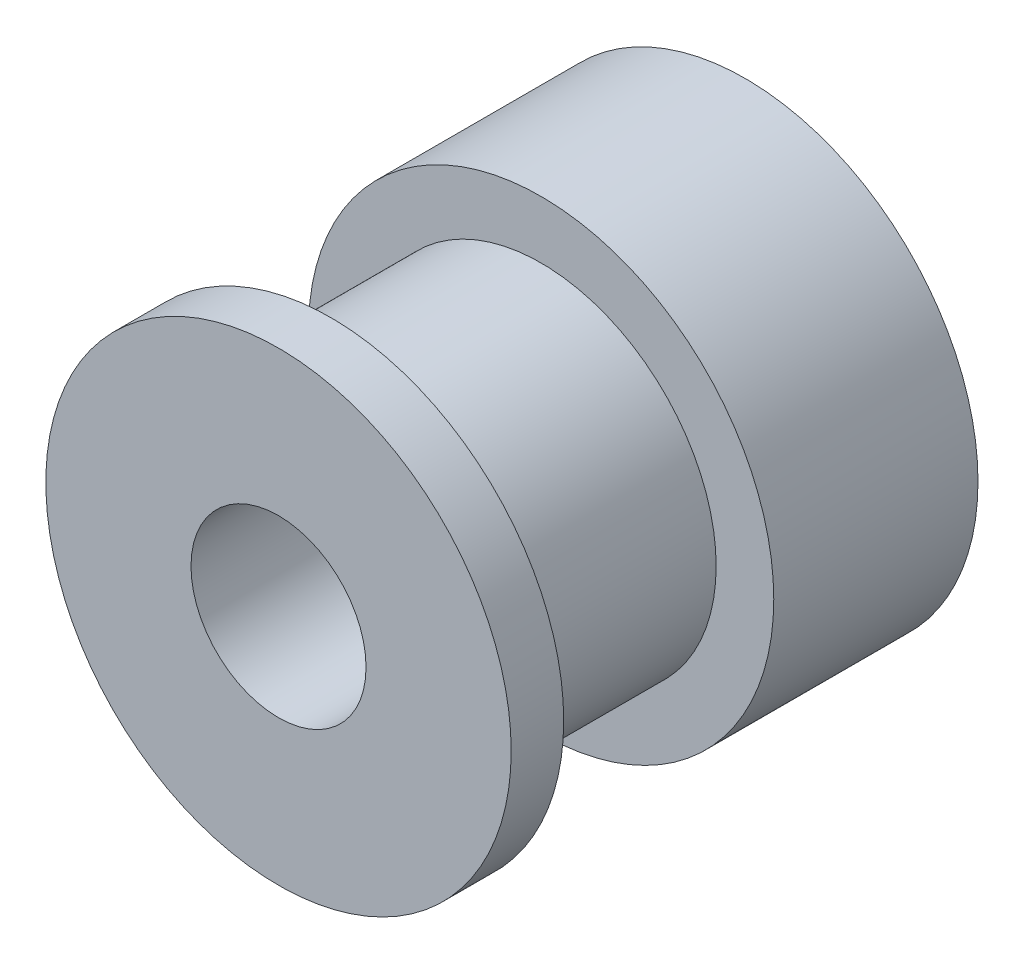
ISO-10303-21;
HEADER;
FILE_DESCRIPTION(('STEP AP214'),'2;1');
FILE_NAME('part.step','',(''),(''),'','','');
FILE_SCHEMA(('AUTOMOTIVE_DESIGN { 1 0 10303 214 1 1 1 1 }'));
ENDSEC;
DATA;
#1=APPLICATION_CONTEXT('core data for automotive mechanical design processes');
#2=APPLICATION_PROTOCOL_DEFINITION('international standard','automotive_design',2000,#1);
#3=PRODUCT_CONTEXT('',#1,'mechanical');
#4=PRODUCT('Part','Part','',(#3));
#5=PRODUCT_RELATED_PRODUCT_CATEGORY('part','',(#4));
#6=PRODUCT_DEFINITION_FORMATION('','',#4);
#7=PRODUCT_DEFINITION_CONTEXT('part definition',#1,'design');
#8=PRODUCT_DEFINITION('design','',#6,#7);
#9=PRODUCT_DEFINITION_SHAPE('','',#8);
#10=(LENGTH_UNIT() NAMED_UNIT(*) SI_UNIT(.MILLI.,.METRE.));
#11=(NAMED_UNIT(*) PLANE_ANGLE_UNIT() SI_UNIT($,.RADIAN.));
#12=(NAMED_UNIT(*) SI_UNIT($,.STERADIAN.) SOLID_ANGLE_UNIT());
#13=UNCERTAINTY_MEASURE_WITH_UNIT(LENGTH_MEASURE(1.E-05),#10,'distance_accuracy_value','');
#14=(GEOMETRIC_REPRESENTATION_CONTEXT(3) GLOBAL_UNCERTAINTY_ASSIGNED_CONTEXT((#13)) GLOBAL_UNIT_ASSIGNED_CONTEXT((#10,
#11,#12)) REPRESENTATION_CONTEXT('',''));
#15=CARTESIAN_POINT('',(0.,0.,0.));
#16=DIRECTION('',(0.,0.,1.));
#17=DIRECTION('',(1.,0.,0.));
#18=AXIS2_PLACEMENT_3D('',#15,#16,#17);
#19=CARTESIAN_POINT('',(0.,0.,7.));
#20=DIRECTION('',(0.,0.,-1.));
#21=DIRECTION('',(-1.,0.,0.));
#22=AXIS2_PLACEMENT_3D('',#19,#20,#21);
#23=CYLINDRICAL_SURFACE('',#22,7.975);
#24=CARTESIAN_POINT('',(0.,0.,7.));
#25=DIRECTION('',(0.,0.,1.));
#26=DIRECTION('',(1.,0.,0.));
#27=AXIS2_PLACEMENT_3D('',#24,#25,#26);
#28=CIRCLE('',#27,7.975);
#29=CARTESIAN_POINT('',(7.975,0.,7.));
#30=VERTEX_POINT('',#29);
#31=EDGE_CURVE('E40',#30,#30,#28,.T.);
#32=ORIENTED_EDGE('',*,*,#31,.F.);
#33=EDGE_LOOP('',(#32));
#34=FACE_BOUND('',#33,.T.);
#35=CARTESIAN_POINT('',(0.,0.,0.));
#36=DIRECTION('',(0.,0.,1.));
#37=DIRECTION('',(1.,0.,0.));
#38=AXIS2_PLACEMENT_3D('',#35,#36,#37);
#39=CIRCLE('',#38,7.975);
#40=CARTESIAN_POINT('',(7.975,0.,0.));
#41=VERTEX_POINT('',#40);
#42=EDGE_CURVE('E36',#41,#41,#39,.T.);
#43=ORIENTED_EDGE('',*,*,#42,.T.);
#44=EDGE_LOOP('',(#43));
#45=FACE_BOUND('',#44,.T.);
#46=ADVANCED_FACE('F33',(#34,#45),#23,.T.);
#47=CARTESIAN_POINT('',(0.,0.,7.));
#48=DIRECTION('',(0.,0.,1.));
#49=DIRECTION('',(1.,0.,0.));
#50=AXIS2_PLACEMENT_3D('',#47,#48,#49);
#51=PLANE('',#50);
#52=CARTESIAN_POINT('',(0.,0.,7.));
#53=DIRECTION('',(0.,0.,1.));
#54=DIRECTION('',(1.,0.,0.));
#55=AXIS2_PLACEMENT_3D('',#52,#53,#54);
#56=CIRCLE('',#55,6.);
#57=CARTESIAN_POINT('',(6.,0.,7.));
#58=VERTEX_POINT('',#57);
#59=EDGE_CURVE('E10',#58,#58,#56,.T.);
#60=ORIENTED_EDGE('',*,*,#59,.F.);
#61=EDGE_LOOP('',(#60));
#62=FACE_BOUND('',#61,.T.);
#63=ORIENTED_EDGE('',*,*,#31,.T.);
#64=EDGE_LOOP('',(#63));
#65=FACE_BOUND('',#64,.T.);
#66=ADVANCED_FACE('F91',(#62,#65),#51,.T.);
#67=CARTESIAN_POINT('',(0.,0.,0.));
#68=DIRECTION('',(0.,0.,1.));
#69=DIRECTION('',(1.,0.,0.));
#70=AXIS2_PLACEMENT_3D('',#67,#68,#69);
#71=PLANE('',#70);
#72=CARTESIAN_POINT('',(0.,0.,0.));
#73=DIRECTION('',(0.,0.,1.));
#74=DIRECTION('',(1.,0.,0.));
#75=AXIS2_PLACEMENT_3D('',#72,#73,#74);
#76=CIRCLE('',#75,3.);
#77=CARTESIAN_POINT('',(3.,0.,0.));
#78=VERTEX_POINT('',#77);
#79=EDGE_CURVE('E53',#78,#78,#76,.T.);
#80=ORIENTED_EDGE('',*,*,#79,.T.);
#81=EDGE_LOOP('',(#80));
#82=FACE_BOUND('',#81,.T.);
#83=ORIENTED_EDGE('',*,*,#42,.F.);
#84=EDGE_LOOP('',(#83));
#85=FACE_BOUND('',#84,.T.);
#86=ADVANCED_FACE('F62',(#82,#85),#71,.F.);
#87=CARTESIAN_POINT('',(0.,0.,14.2));
#88=DIRECTION('',(0.,0.,-1.));
#89=DIRECTION('',(-1.,0.,0.));
#90=AXIS2_PLACEMENT_3D('',#87,#88,#89);
#91=CYLINDRICAL_SURFACE('',#90,6.);
#92=CARTESIAN_POINT('',(0.,0.,14.2));
#93=DIRECTION('',(0.,0.,1.));
#94=DIRECTION('',(1.,0.,0.));
#95=AXIS2_PLACEMENT_3D('',#92,#93,#94);
#96=CIRCLE('',#95,6.);
#97=CARTESIAN_POINT('',(6.,0.,14.2));
#98=VERTEX_POINT('',#97);
#99=EDGE_CURVE('E46',#98,#98,#96,.T.);
#100=ORIENTED_EDGE('',*,*,#99,.F.);
#101=EDGE_LOOP('',(#100));
#102=FACE_BOUND('',#101,.T.);
#103=ORIENTED_EDGE('',*,*,#59,.T.);
#104=EDGE_LOOP('',(#103));
#105=FACE_BOUND('',#104,.T.);
#106=ADVANCED_FACE('F81',(#102,#105),#91,.T.);
#107=CARTESIAN_POINT('',(0.,0.,16.));
#108=DIRECTION('',(0.,0.,-1.));
#109=DIRECTION('',(-1.,0.,0.));
#110=AXIS2_PLACEMENT_3D('',#107,#108,#109);
#111=CYLINDRICAL_SURFACE('',#110,7.975);
#112=CARTESIAN_POINT('',(0.,0.,16.));
#113=DIRECTION('',(0.,0.,1.));
#114=DIRECTION('',(1.,0.,0.));
#115=AXIS2_PLACEMENT_3D('',#112,#113,#114);
#116=CIRCLE('',#115,7.975);
#117=CARTESIAN_POINT('',(7.975,0.,16.));
#118=VERTEX_POINT('',#117);
#119=EDGE_CURVE('E49',#118,#118,#116,.T.);
#120=ORIENTED_EDGE('',*,*,#119,.F.);
#121=EDGE_LOOP('',(#120));
#122=FACE_BOUND('',#121,.T.);
#123=CARTESIAN_POINT('',(0.,0.,14.2));
#124=DIRECTION('',(0.,0.,1.));
#125=DIRECTION('',(1.,0.,0.));
#126=AXIS2_PLACEMENT_3D('',#123,#124,#125);
#127=CIRCLE('',#126,7.975);
#128=CARTESIAN_POINT('',(7.975,0.,14.2));
#129=VERTEX_POINT('',#128);
#130=EDGE_CURVE('E50',#129,#129,#127,.T.);
#131=ORIENTED_EDGE('',*,*,#130,.T.);
#132=EDGE_LOOP('',(#131));
#133=FACE_BOUND('',#132,.T.);
#134=ADVANCED_FACE('F75',(#122,#133),#111,.T.);
#135=CARTESIAN_POINT('',(0.,0.,16.));
#136=DIRECTION('',(0.,0.,1.));
#137=DIRECTION('',(1.,0.,0.));
#138=AXIS2_PLACEMENT_3D('',#135,#136,#137);
#139=PLANE('',#138);
#140=CARTESIAN_POINT('',(0.,0.,16.));
#141=DIRECTION('',(0.,0.,1.));
#142=DIRECTION('',(1.,0.,0.));
#143=AXIS2_PLACEMENT_3D('',#140,#141,#142);
#144=CIRCLE('',#143,3.);
#145=CARTESIAN_POINT('',(3.,0.,16.));
#146=VERTEX_POINT('',#145);
#147=EDGE_CURVE('E56',#146,#146,#144,.T.);
#148=ORIENTED_EDGE('',*,*,#147,.F.);
#149=EDGE_LOOP('',(#148));
#150=FACE_BOUND('',#149,.T.);
#151=ORIENTED_EDGE('',*,*,#119,.T.);
#152=EDGE_LOOP('',(#151));
#153=FACE_BOUND('',#152,.T.);
#154=ADVANCED_FACE('F72',(#150,#153),#139,.T.);
#155=CARTESIAN_POINT('',(0.,0.,14.2));
#156=DIRECTION('',(0.,0.,1.));
#157=DIRECTION('',(1.,0.,0.));
#158=AXIS2_PLACEMENT_3D('',#155,#156,#157);
#159=PLANE('',#158);
#160=ORIENTED_EDGE('',*,*,#99,.T.);
#161=EDGE_LOOP('',(#160));
#162=FACE_BOUND('',#161,.T.);
#163=ORIENTED_EDGE('',*,*,#130,.F.);
#164=EDGE_LOOP('',(#163));
#165=FACE_BOUND('',#164,.T.);
#166=ADVANCED_FACE('F68',(#162,#165),#159,.F.);
#167=CARTESIAN_POINT('',(0.,0.,0.));
#168=DIRECTION('',(0.,0.,1.));
#169=DIRECTION('',(1.,0.,0.));
#170=AXIS2_PLACEMENT_3D('',#167,#168,#169);
#171=CYLINDRICAL_SURFACE('',#170,3.);
#172=ORIENTED_EDGE('',*,*,#79,.F.);
#173=EDGE_LOOP('',(#172));
#174=FACE_BOUND('',#173,.T.);
#175=ORIENTED_EDGE('',*,*,#147,.T.);
#176=EDGE_LOOP('',(#175));
#177=FACE_BOUND('',#176,.T.);
#178=ADVANCED_FACE('F65',(#174,#177),#171,.F.);
#179=CLOSED_SHELL('',(#46,#66,#86,#106,#134,#154,#166,#178));
#180=MANIFOLD_SOLID_BREP('B2',#179);
#181=ADVANCED_BREP_SHAPE_REPRESENTATION('',(#18,#180),#14);
#182=SHAPE_DEFINITION_REPRESENTATION(#9,#181);
ENDSEC;
END-ISO-10303-21;
